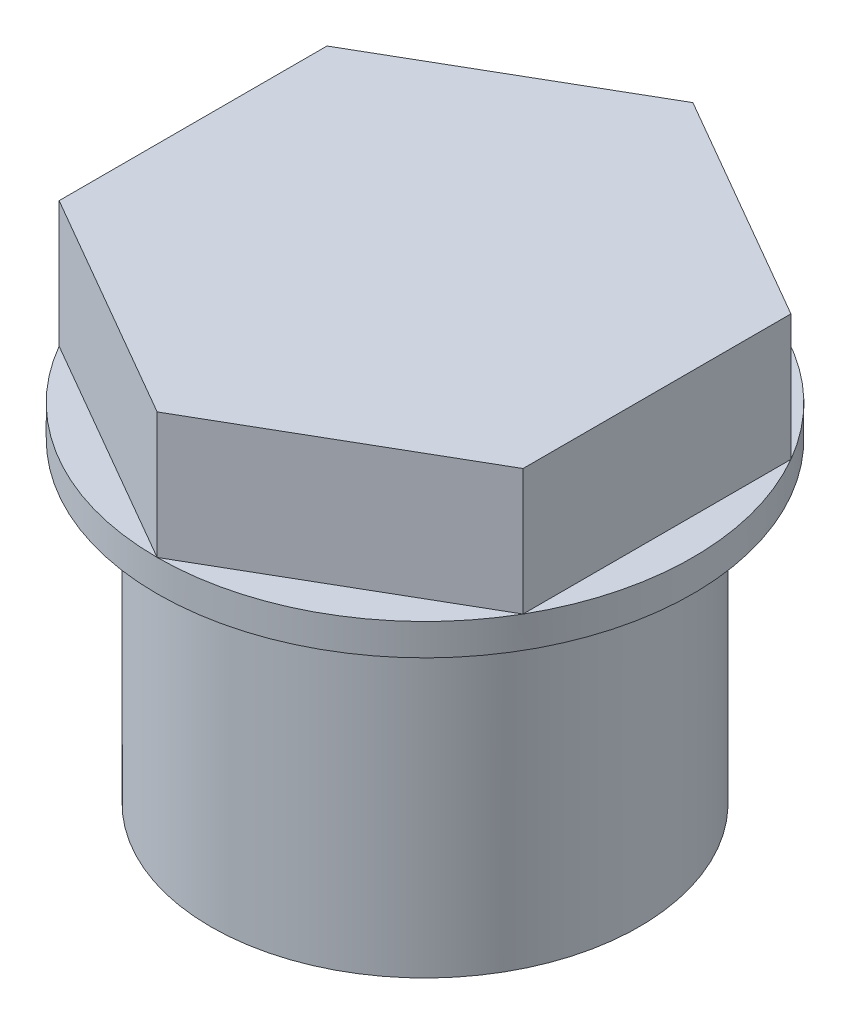
ISO-10303-21;
HEADER;
FILE_DESCRIPTION(('STEP AP214'),'2;1');
FILE_NAME('part.step','',(''),(''),'','','');
FILE_SCHEMA(('AUTOMOTIVE_DESIGN { 1 0 10303 214 1 1 1 1 }'));
ENDSEC;
DATA;
#1=APPLICATION_CONTEXT('core data for automotive mechanical design processes');
#2=APPLICATION_PROTOCOL_DEFINITION('international standard','automotive_design',2000,#1);
#3=PRODUCT_CONTEXT('',#1,'mechanical');
#4=PRODUCT('Part','Part','',(#3));
#5=PRODUCT_RELATED_PRODUCT_CATEGORY('part','',(#4));
#6=PRODUCT_DEFINITION_FORMATION('','',#4);
#7=PRODUCT_DEFINITION_CONTEXT('part definition',#1,'design');
#8=PRODUCT_DEFINITION('design','',#6,#7);
#9=PRODUCT_DEFINITION_SHAPE('','',#8);
#10=(LENGTH_UNIT() NAMED_UNIT(*) SI_UNIT(.MILLI.,.METRE.));
#11=(NAMED_UNIT(*) PLANE_ANGLE_UNIT() SI_UNIT($,.RADIAN.));
#12=(NAMED_UNIT(*) SI_UNIT($,.STERADIAN.) SOLID_ANGLE_UNIT());
#13=UNCERTAINTY_MEASURE_WITH_UNIT(LENGTH_MEASURE(1.E-05),#10,'distance_accuracy_value','');
#14=(GEOMETRIC_REPRESENTATION_CONTEXT(3) GLOBAL_UNCERTAINTY_ASSIGNED_CONTEXT((#13)) GLOBAL_UNIT_ASSIGNED_CONTEXT((#10,
#11,#12)) REPRESENTATION_CONTEXT('',''));
#15=CARTESIAN_POINT('',(0.,0.,0.));
#16=DIRECTION('',(0.,0.,1.));
#17=DIRECTION('',(1.,0.,0.));
#18=AXIS2_PLACEMENT_3D('',#15,#16,#17);
#19=CARTESIAN_POINT('',(0.,0.,0.));
#20=DIRECTION('',(0.,1.,0.));
#21=DIRECTION('',(0.,0.,1.));
#22=AXIS2_PLACEMENT_3D('',#19,#20,#21);
#23=PLANE('',#22);
#24=CARTESIAN_POINT('',(0.,0.,0.));
#25=DIRECTION('',(0.,1.,0.));
#26=DIRECTION('',(0.,0.,1.));
#27=AXIS2_PLACEMENT_3D('',#24,#25,#26);
#28=CIRCLE('',#27,8.5);
#29=CARTESIAN_POINT('',(0.,0.,8.5));
#30=VERTEX_POINT('',#29);
#31=EDGE_CURVE('E114',#30,#30,#28,.T.);
#32=ORIENTED_EDGE('',*,*,#31,.F.);
#33=EDGE_LOOP('',(#32));
#34=FACE_BOUND('',#33,.T.);
#35=CARTESIAN_POINT('',(0.,0.,0.));
#36=DIRECTION('',(0.,1.,0.));
#37=DIRECTION('',(0.,0.,1.));
#38=AXIS2_PLACEMENT_3D('',#35,#36,#37);
#39=CIRCLE('',#38,6.8);
#40=CARTESIAN_POINT('',(0.,0.,6.8));
#41=VERTEX_POINT('',#40);
#42=EDGE_CURVE('E11',#41,#41,#39,.F.);
#43=ORIENTED_EDGE('',*,*,#42,.F.);
#44=EDGE_LOOP('',(#43));
#45=FACE_BOUND('',#44,.T.);
#46=ADVANCED_FACE('F36',(#34,#45),#23,.F.);
#47=CARTESIAN_POINT('',(0.,1.,0.));
#48=DIRECTION('',(0.,1.,0.));
#49=DIRECTION('',(0.,0.,1.));
#50=AXIS2_PLACEMENT_3D('',#47,#48,#49);
#51=PLANE('',#50);
#52=DIRECTION('',(-0.866025403784439,0.,-0.5));
#53=VECTOR('',#52,1.);
#54=CARTESIAN_POINT('',(7.36121593216773,1.,-4.25000000000001));
#55=LINE('',#54,#53);
#56=CARTESIAN_POINT('',(7.36121593216773,1.,-4.25));
#57=VERTEX_POINT('',#56);
#58=CARTESIAN_POINT('',(0.,1.,-8.5));
#59=VERTEX_POINT('',#58);
#60=EDGE_CURVE('E113',#57,#59,#55,.T.);
#61=ORIENTED_EDGE('',*,*,#60,.F.);
#62=CARTESIAN_POINT('',(0.,1.,0.));
#63=DIRECTION('',(0.,1.,0.));
#64=DIRECTION('',(0.,0.,1.));
#65=AXIS2_PLACEMENT_3D('',#62,#63,#64);
#66=CIRCLE('',#65,8.5);
#67=EDGE_CURVE('E128',#57,#59,#66,.T.);
#68=ORIENTED_EDGE('',*,*,#67,.T.);
#69=EDGE_LOOP('',(#61,#68));
#70=FACE_BOUND('',#69,.T.);
#71=ADVANCED_FACE('F139',(#70),#51,.T.);
#72=DIRECTION('',(0.,0.,-1.));
#73=VECTOR('',#72,1.);
#74=CARTESIAN_POINT('',(7.36121593216773,1.,4.25000000000001));
#75=LINE('',#74,#73);
#76=CARTESIAN_POINT('',(7.36121593216772,1.,4.25000000000001));
#77=VERTEX_POINT('',#76);
#78=EDGE_CURVE('E110',#77,#57,#75,.T.);
#79=ORIENTED_EDGE('',*,*,#78,.F.);
#80=EDGE_CURVE('E123',#77,#57,#66,.T.);
#81=ORIENTED_EDGE('',*,*,#80,.T.);
#82=EDGE_LOOP('',(#79,#81));
#83=FACE_BOUND('',#82,.T.);
#84=ADVANCED_FACE('F145',(#83),#51,.T.);
#85=DIRECTION('',(0.866025403784439,0.,-0.5));
#86=VECTOR('',#85,1.);
#87=CARTESIAN_POINT('',(0.,1.,8.5));
#88=LINE('',#87,#86);
#89=CARTESIAN_POINT('',(0.,1.,8.5));
#90=VERTEX_POINT('',#89);
#91=EDGE_CURVE('E152',#90,#77,#88,.T.);
#92=ORIENTED_EDGE('',*,*,#91,.F.);
#93=EDGE_CURVE('E44',#90,#77,#66,.T.);
#94=ORIENTED_EDGE('',*,*,#93,.T.);
#95=EDGE_LOOP('',(#92,#94));
#96=FACE_BOUND('',#95,.T.);
#97=ADVANCED_FACE('F179',(#96),#51,.T.);
#98=DIRECTION('',(0.866025403784439,0.,0.5));
#99=VECTOR('',#98,1.);
#100=CARTESIAN_POINT('',(-7.36121593216773,1.,4.25));
#101=LINE('',#100,#99);
#102=CARTESIAN_POINT('',(-7.36121593216773,1.,4.25));
#103=VERTEX_POINT('',#102);
#104=EDGE_CURVE('E50',#103,#90,#101,.T.);
#105=ORIENTED_EDGE('',*,*,#104,.F.);
#106=EDGE_CURVE('E117',#103,#90,#66,.T.);
#107=ORIENTED_EDGE('',*,*,#106,.T.);
#108=EDGE_LOOP('',(#105,#107));
#109=FACE_BOUND('',#108,.T.);
#110=ADVANCED_FACE('F181',(#109),#51,.T.);
#111=DIRECTION('',(0.,0.,1.));
#112=VECTOR('',#111,1.);
#113=CARTESIAN_POINT('',(-7.36121593216773,1.,-4.25));
#114=LINE('',#113,#112);
#115=CARTESIAN_POINT('',(-7.36121593216773,1.,-4.25));
#116=VERTEX_POINT('',#115);
#117=EDGE_CURVE('E171',#116,#103,#114,.T.);
#118=ORIENTED_EDGE('',*,*,#117,.F.);
#119=EDGE_CURVE('E129',#116,#103,#66,.T.);
#120=ORIENTED_EDGE('',*,*,#119,.T.);
#121=EDGE_LOOP('',(#118,#120));
#122=FACE_BOUND('',#121,.T.);
#123=ADVANCED_FACE('F187',(#122),#51,.T.);
#124=CARTESIAN_POINT('',(0.,1.,0.));
#125=DIRECTION('',(0.,-1.,0.));
#126=DIRECTION('',(0.,0.,-1.));
#127=AXIS2_PLACEMENT_3D('',#124,#125,#126);
#128=CYLINDRICAL_SURFACE('',#127,8.5);
#129=ORIENTED_EDGE('',*,*,#93,.F.);
#130=ORIENTED_EDGE('',*,*,#106,.F.);
#131=ORIENTED_EDGE('',*,*,#119,.F.);
#132=EDGE_CURVE('E131',#59,#116,#66,.T.);
#133=ORIENTED_EDGE('',*,*,#132,.F.);
#134=ORIENTED_EDGE('',*,*,#67,.F.);
#135=ORIENTED_EDGE('',*,*,#80,.F.);
#136=EDGE_LOOP('',(#129,#130,#131,#133,#134,#135));
#137=FACE_BOUND('',#136,.T.);
#138=ORIENTED_EDGE('',*,*,#31,.T.);
#139=EDGE_LOOP('',(#138));
#140=FACE_BOUND('',#139,.T.);
#141=ADVANCED_FACE('F38',(#137,#140),#128,.T.);
#142=DIRECTION('',(-0.866025403784439,0.,0.5));
#143=VECTOR('',#142,1.);
#144=CARTESIAN_POINT('',(0.,1.,-8.5));
#145=LINE('',#144,#143);
#146=EDGE_CURVE('E57',#59,#116,#145,.T.);
#147=ORIENTED_EDGE('',*,*,#146,.F.);
#148=ORIENTED_EDGE('',*,*,#132,.T.);
#149=EDGE_LOOP('',(#147,#148));
#150=FACE_BOUND('',#149,.T.);
#151=ADVANCED_FACE('F188',(#150),#51,.T.);
#152=CARTESIAN_POINT('',(7.36121593216773,5.,-4.25000000000001));
#153=DIRECTION('',(-0.499999999999999,0.,0.866025403784439));
#154=DIRECTION('',(0.866025403784439,0.,0.5));
#155=AXIS2_PLACEMENT_3D('',#152,#153,#154);
#156=PLANE('',#155);
#157=ORIENTED_EDGE('',*,*,#60,.T.);
#158=DIRECTION('',(0.,-1.,0.));
#159=VECTOR('',#158,1.);
#160=CARTESIAN_POINT('',(0.,5.,-8.5));
#161=LINE('',#160,#159);
#162=CARTESIAN_POINT('',(0.,5.,-8.5));
#163=VERTEX_POINT('',#162);
#164=EDGE_CURVE('E94',#163,#59,#161,.T.);
#165=ORIENTED_EDGE('',*,*,#164,.F.);
#166=DIRECTION('',(-0.866025403784439,0.,-0.5));
#167=VECTOR('',#166,1.);
#168=CARTESIAN_POINT('',(7.36121593216773,5.,-4.25000000000001));
#169=LINE('',#168,#167);
#170=CARTESIAN_POINT('',(7.36121593216773,5.,-4.25000000000001));
#171=VERTEX_POINT('',#170);
#172=EDGE_CURVE('E101',#171,#163,#169,.T.);
#173=ORIENTED_EDGE('',*,*,#172,.F.);
#174=DIRECTION('',(0.,-1.,0.));
#175=VECTOR('',#174,1.);
#176=CARTESIAN_POINT('',(7.36121593216773,5.,-4.25000000000001));
#177=LINE('',#176,#175);
#178=EDGE_CURVE('E149',#171,#57,#177,.T.);
#179=ORIENTED_EDGE('',*,*,#178,.T.);
#180=EDGE_LOOP('',(#157,#165,#173,#179));
#181=FACE_BOUND('',#180,.T.);
#182=ADVANCED_FACE('F112',(#181),#156,.F.);
#183=CARTESIAN_POINT('',(0.,5.,-8.5));
#184=DIRECTION('',(0.5,0.,0.866025403784439));
#185=DIRECTION('',(0.866025403784439,0.,-0.5));
#186=AXIS2_PLACEMENT_3D('',#183,#184,#185);
#187=PLANE('',#186);
#188=ORIENTED_EDGE('',*,*,#146,.T.);
#189=DIRECTION('',(0.,-1.,0.));
#190=VECTOR('',#189,1.);
#191=CARTESIAN_POINT('',(-7.36121593216773,5.,-4.25));
#192=LINE('',#191,#190);
#193=CARTESIAN_POINT('',(-7.36121593216773,5.,-4.25));
#194=VERTEX_POINT('',#193);
#195=EDGE_CURVE('E97',#194,#116,#192,.T.);
#196=ORIENTED_EDGE('',*,*,#195,.F.);
#197=DIRECTION('',(-0.866025403784439,0.,0.5));
#198=VECTOR('',#197,1.);
#199=CARTESIAN_POINT('',(0.,5.,-8.5));
#200=LINE('',#199,#198);
#201=EDGE_CURVE('E90',#163,#194,#200,.T.);
#202=ORIENTED_EDGE('',*,*,#201,.F.);
#203=ORIENTED_EDGE('',*,*,#164,.T.);
#204=EDGE_LOOP('',(#188,#196,#202,#203));
#205=FACE_BOUND('',#204,.T.);
#206=ADVANCED_FACE('F92',(#205),#187,.F.);
#207=CARTESIAN_POINT('',(-7.36121593216773,5.,-4.25));
#208=DIRECTION('',(1.,0.,0.));
#209=DIRECTION('',(0.,0.,-1.));
#210=AXIS2_PLACEMENT_3D('',#207,#208,#209);
#211=PLANE('',#210);
#212=ORIENTED_EDGE('',*,*,#117,.T.);
#213=DIRECTION('',(0.,-1.,0.));
#214=VECTOR('',#213,1.);
#215=CARTESIAN_POINT('',(-7.36121593216773,5.,4.25));
#216=LINE('',#215,#214);
#217=CARTESIAN_POINT('',(-7.36121593216773,5.,4.25));
#218=VERTEX_POINT('',#217);
#219=EDGE_CURVE('E118',#218,#103,#216,.T.);
#220=ORIENTED_EDGE('',*,*,#219,.F.);
#221=DIRECTION('',(0.,0.,1.));
#222=VECTOR('',#221,1.);
#223=CARTESIAN_POINT('',(-7.36121593216773,5.,-4.25));
#224=LINE('',#223,#222);
#225=EDGE_CURVE('E100',#194,#218,#224,.T.);
#226=ORIENTED_EDGE('',*,*,#225,.F.);
#227=ORIENTED_EDGE('',*,*,#195,.T.);
#228=EDGE_LOOP('',(#212,#220,#226,#227));
#229=FACE_BOUND('',#228,.T.);
#230=ADVANCED_FACE('F170',(#229),#211,.F.);
#231=CARTESIAN_POINT('',(-7.36121593216773,5.,4.25));
#232=DIRECTION('',(0.5,0.,-0.866025403784439));
#233=DIRECTION('',(-0.866025403784439,0.,-0.5));
#234=AXIS2_PLACEMENT_3D('',#231,#232,#233);
#235=PLANE('',#234);
#236=ORIENTED_EDGE('',*,*,#104,.T.);
#237=DIRECTION('',(0.,-1.,0.));
#238=VECTOR('',#237,1.);
#239=CARTESIAN_POINT('',(0.,5.,8.5));
#240=LINE('',#239,#238);
#241=CARTESIAN_POINT('',(0.,5.,8.5));
#242=VERTEX_POINT('',#241);
#243=EDGE_CURVE('E155',#242,#90,#240,.T.);
#244=ORIENTED_EDGE('',*,*,#243,.F.);
#245=DIRECTION('',(0.866025403784439,0.,0.5));
#246=VECTOR('',#245,1.);
#247=CARTESIAN_POINT('',(-7.36121593216773,5.,4.25));
#248=LINE('',#247,#246);
#249=EDGE_CURVE('E168',#218,#242,#248,.T.);
#250=ORIENTED_EDGE('',*,*,#249,.F.);
#251=ORIENTED_EDGE('',*,*,#219,.T.);
#252=EDGE_LOOP('',(#236,#244,#250,#251));
#253=FACE_BOUND('',#252,.T.);
#254=ADVANCED_FACE('F166',(#253),#235,.F.);
#255=CARTESIAN_POINT('',(0.,5.,8.5));
#256=DIRECTION('',(-0.499999999999999,0.,-0.866025403784439));
#257=DIRECTION('',(-0.866025403784439,0.,0.5));
#258=AXIS2_PLACEMENT_3D('',#255,#256,#257);
#259=PLANE('',#258);
#260=ORIENTED_EDGE('',*,*,#91,.T.);
#261=DIRECTION('',(0.,-1.,0.));
#262=VECTOR('',#261,1.);
#263=CARTESIAN_POINT('',(7.36121593216773,5.,4.25000000000001));
#264=LINE('',#263,#262);
#265=CARTESIAN_POINT('',(7.36121593216773,5.,4.25000000000001));
#266=VERTEX_POINT('',#265);
#267=EDGE_CURVE('E151',#266,#77,#264,.T.);
#268=ORIENTED_EDGE('',*,*,#267,.F.);
#269=DIRECTION('',(0.866025403784439,0.,-0.5));
#270=VECTOR('',#269,1.);
#271=CARTESIAN_POINT('',(0.,5.,8.5));
#272=LINE('',#271,#270);
#273=EDGE_CURVE('E157',#242,#266,#272,.T.);
#274=ORIENTED_EDGE('',*,*,#273,.F.);
#275=ORIENTED_EDGE('',*,*,#243,.T.);
#276=EDGE_LOOP('',(#260,#268,#274,#275));
#277=FACE_BOUND('',#276,.T.);
#278=ADVANCED_FACE('F177',(#277),#259,.F.);
#279=CARTESIAN_POINT('',(7.36121593216773,5.,4.25000000000001));
#280=DIRECTION('',(-1.,0.,0.));
#281=DIRECTION('',(0.,0.,1.));
#282=AXIS2_PLACEMENT_3D('',#279,#280,#281);
#283=PLANE('',#282);
#284=ORIENTED_EDGE('',*,*,#78,.T.);
#285=ORIENTED_EDGE('',*,*,#178,.F.);
#286=DIRECTION('',(0.,0.,-1.));
#287=VECTOR('',#286,1.);
#288=CARTESIAN_POINT('',(7.36121593216773,5.,4.25000000000001));
#289=LINE('',#288,#287);
#290=EDGE_CURVE('E106',#266,#171,#289,.T.);
#291=ORIENTED_EDGE('',*,*,#290,.F.);
#292=ORIENTED_EDGE('',*,*,#267,.T.);
#293=EDGE_LOOP('',(#284,#285,#291,#292));
#294=FACE_BOUND('',#293,.T.);
#295=ADVANCED_FACE('F148',(#294),#283,.F.);
#296=CARTESIAN_POINT('',(-7.36121593216773,5.,-12.75));
#297=DIRECTION('',(0.,1.,0.));
#298=DIRECTION('',(0.,0.,1.));
#299=AXIS2_PLACEMENT_3D('',#296,#297,#298);
#300=PLANE('',#299);
#301=ORIENTED_EDGE('',*,*,#172,.T.);
#302=ORIENTED_EDGE('',*,*,#201,.T.);
#303=ORIENTED_EDGE('',*,*,#225,.T.);
#304=ORIENTED_EDGE('',*,*,#249,.T.);
#305=ORIENTED_EDGE('',*,*,#273,.T.);
#306=ORIENTED_EDGE('',*,*,#290,.T.);
#307=EDGE_LOOP('',(#301,#302,#303,#304,#305,#306));
#308=FACE_BOUND('',#307,.T.);
#309=ADVANCED_FACE('F104',(#308),#300,.T.);
#310=CARTESIAN_POINT('',(0.,-10.,0.));
#311=DIRECTION('',(0.,1.,0.));
#312=DIRECTION('',(0.,0.,1.));
#313=AXIS2_PLACEMENT_3D('',#310,#311,#312);
#314=CYLINDRICAL_SURFACE('',#313,6.8);
#315=CARTESIAN_POINT('',(0.,-10.,0.));
#316=DIRECTION('',(0.,-1.,0.));
#317=DIRECTION('',(0.,0.,-1.));
#318=AXIS2_PLACEMENT_3D('',#315,#316,#317);
#319=CIRCLE('',#318,6.8);
#320=CARTESIAN_POINT('',(0.,-10.,-6.8));
#321=VERTEX_POINT('',#320);
#322=EDGE_CURVE('E323',#321,#321,#319,.T.);
#323=ORIENTED_EDGE('',*,*,#322,.F.);
#324=EDGE_LOOP('',(#323));
#325=FACE_BOUND('',#324,.T.);
#326=ORIENTED_EDGE('',*,*,#42,.T.);
#327=EDGE_LOOP('',(#326));
#328=FACE_BOUND('',#327,.T.);
#329=ADVANCED_FACE('F199',(#325,#328),#314,.T.);
#330=CARTESIAN_POINT('',(0.,-10.,0.));
#331=DIRECTION('',(0.,-1.,0.));
#332=DIRECTION('',(0.,0.,-1.));
#333=AXIS2_PLACEMENT_3D('',#330,#331,#332);
#334=PLANE('',#333);
#335=ORIENTED_EDGE('',*,*,#322,.T.);
#336=EDGE_LOOP('',(#335));
#337=FACE_BOUND('',#336,.T.);
#338=ADVANCED_FACE('F201',(#337),#334,.T.);
#339=CLOSED_SHELL('',(#46,#71,#84,#97,#110,#123,#141,#151,#182,#206,#230,#254,#278,#295,#309,
#329,#338));
#340=MANIFOLD_SOLID_BREP('B2',#339);
#341=ADVANCED_BREP_SHAPE_REPRESENTATION('',(#18,#340),#14);
#342=SHAPE_DEFINITION_REPRESENTATION(#9,#341);
ENDSEC;
END-ISO-10303-21;
